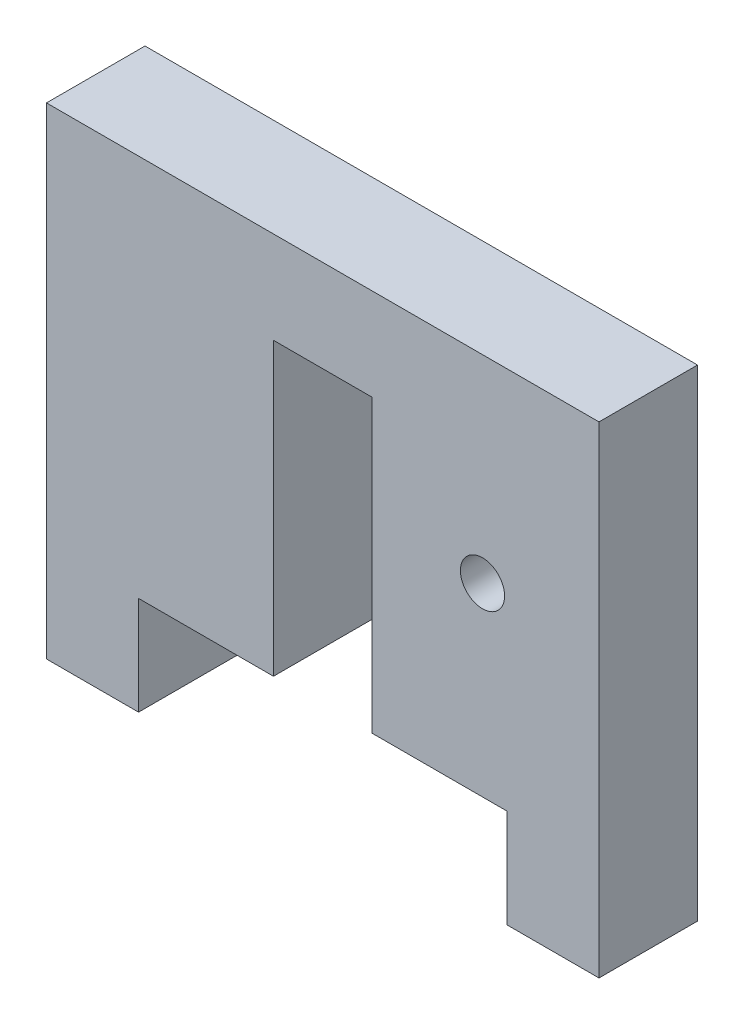
ISO-10303-21;
HEADER;
FILE_DESCRIPTION(('STEP AP214'),'2;1');
FILE_NAME('part.step','',(''),(''),'','','');
FILE_SCHEMA(('AUTOMOTIVE_DESIGN { 1 0 10303 214 1 1 1 1 }'));
ENDSEC;
DATA;
#1=APPLICATION_CONTEXT('core data for automotive mechanical design processes');
#2=APPLICATION_PROTOCOL_DEFINITION('international standard','automotive_design',2000,#1);
#3=PRODUCT_CONTEXT('',#1,'mechanical');
#4=PRODUCT('Part','Part','',(#3));
#5=PRODUCT_RELATED_PRODUCT_CATEGORY('part','',(#4));
#6=PRODUCT_DEFINITION_FORMATION('','',#4);
#7=PRODUCT_DEFINITION_CONTEXT('part definition',#1,'design');
#8=PRODUCT_DEFINITION('design','',#6,#7);
#9=PRODUCT_DEFINITION_SHAPE('','',#8);
#10=(LENGTH_UNIT() NAMED_UNIT(*) SI_UNIT(.MILLI.,.METRE.));
#11=(NAMED_UNIT(*) PLANE_ANGLE_UNIT() SI_UNIT($,.RADIAN.));
#12=(NAMED_UNIT(*) SI_UNIT($,.STERADIAN.) SOLID_ANGLE_UNIT());
#13=UNCERTAINTY_MEASURE_WITH_UNIT(LENGTH_MEASURE(1.E-05),#10,'distance_accuracy_value','');
#14=(GEOMETRIC_REPRESENTATION_CONTEXT(3) GLOBAL_UNCERTAINTY_ASSIGNED_CONTEXT((#13)) GLOBAL_UNIT_ASSIGNED_CONTEXT((#10,
#11,#12)) REPRESENTATION_CONTEXT('',''));
#15=CARTESIAN_POINT('',(0.,0.,0.));
#16=DIRECTION('',(0.,0.,1.));
#17=DIRECTION('',(1.,0.,0.));
#18=AXIS2_PLACEMENT_3D('',#15,#16,#17);
#19=CARTESIAN_POINT('',(0.,0.,5.35));
#20=DIRECTION('',(0.,0.,-1.));
#21=DIRECTION('',(-1.,0.,0.));
#22=AXIS2_PLACEMENT_3D('',#19,#20,#21);
#23=PLANE('',#22);
#24=DIRECTION('',(-1.,0.,0.));
#25=VECTOR('',#24,1.);
#26=CARTESIAN_POINT('',(0.,26.1499993503,5.35));
#27=LINE('',#26,#25);
#28=CARTESIAN_POINT('',(29.9999993294,26.1499993503,5.35));
#29=VERTEX_POINT('',#28);
#30=CARTESIAN_POINT('',(0.,26.1499993503,5.35));
#31=VERTEX_POINT('',#30);
#32=EDGE_CURVE('E177',#29,#31,#27,.T.);
#33=ORIENTED_EDGE('',*,*,#32,.T.);
#34=DIRECTION('',(0.,-1.,0.));
#35=VECTOR('',#34,1.);
#36=CARTESIAN_POINT('',(0.,0.,5.35));
#37=LINE('',#36,#35);
#38=CARTESIAN_POINT('',(0.,0.,5.35));
#39=VERTEX_POINT('',#38);
#40=EDGE_CURVE('E105',#31,#39,#37,.T.);
#41=ORIENTED_EDGE('',*,*,#40,.T.);
#42=DIRECTION('',(1.,0.,0.));
#43=VECTOR('',#42,1.);
#44=CARTESIAN_POINT('',(4.9999989569,0.,5.35));
#45=LINE('',#44,#43);
#46=CARTESIAN_POINT('',(4.9999989569,0.,5.35));
#47=VERTEX_POINT('',#46);
#48=EDGE_CURVE('E204',#39,#47,#45,.T.);
#49=ORIENTED_EDGE('',*,*,#48,.T.);
#50=DIRECTION('',(0.,1.,0.));
#51=VECTOR('',#50,1.);
#52=CARTESIAN_POINT('',(4.9999989569,5.350000225,5.35));
#53=LINE('',#52,#51);
#54=CARTESIAN_POINT('',(4.9999989569,5.350000225,5.35));
#55=VERTEX_POINT('',#54);
#56=EDGE_CURVE('E223',#47,#55,#53,.T.);
#57=ORIENTED_EDGE('',*,*,#56,.T.);
#58=DIRECTION('',(1.,0.,0.));
#59=VECTOR('',#58,1.);
#60=CARTESIAN_POINT('',(12.3250000179,5.350000225,5.35));
#61=LINE('',#60,#59);
#62=CARTESIAN_POINT('',(12.3250000179,5.350000225,5.35));
#63=VERTEX_POINT('',#62);
#64=EDGE_CURVE('E220',#55,#63,#61,.T.);
#65=ORIENTED_EDGE('',*,*,#64,.T.);
#66=DIRECTION('',(0.,1.,0.));
#67=VECTOR('',#66,1.);
#68=CARTESIAN_POINT('',(12.3250000179,21.1500003934,5.35));
#69=LINE('',#68,#67);
#70=CARTESIAN_POINT('',(12.3250000179,21.1500003934,5.35));
#71=VERTEX_POINT('',#70);
#72=EDGE_CURVE('E222',#63,#71,#69,.T.);
#73=ORIENTED_EDGE('',*,*,#72,.T.);
#74=DIRECTION('',(1.,0.,0.));
#75=VECTOR('',#74,1.);
#76=CARTESIAN_POINT('',(17.6749993116,21.1500003934,5.35));
#77=LINE('',#76,#75);
#78=CARTESIAN_POINT('',(17.6749993116,21.1500003934,5.35));
#79=VERTEX_POINT('',#78);
#80=EDGE_CURVE('E225',#71,#79,#77,.T.);
#81=ORIENTED_EDGE('',*,*,#80,.T.);
#82=DIRECTION('',(0.,-1.,0.));
#83=VECTOR('',#82,1.);
#84=CARTESIAN_POINT('',(17.6749993116,5.350000225,5.35));
#85=LINE('',#84,#83);
#86=CARTESIAN_POINT('',(17.6749993116,5.350000225,5.35));
#87=VERTEX_POINT('',#86);
#88=EDGE_CURVE('E231',#79,#87,#85,.T.);
#89=ORIENTED_EDGE('',*,*,#88,.T.);
#90=DIRECTION('',(1.,0.,0.));
#91=VECTOR('',#90,1.);
#92=CARTESIAN_POINT('',(24.9999994412,5.350000225,5.35));
#93=LINE('',#92,#91);
#94=CARTESIAN_POINT('',(24.9999994412,5.350000225,5.35));
#95=VERTEX_POINT('',#94);
#96=EDGE_CURVE('E136',#87,#95,#93,.T.);
#97=ORIENTED_EDGE('',*,*,#96,.T.);
#98=DIRECTION('',(0.,-1.,0.));
#99=VECTOR('',#98,1.);
#100=CARTESIAN_POINT('',(24.9999994412,0.,5.35));
#101=LINE('',#100,#99);
#102=CARTESIAN_POINT('',(24.9999994412,0.,5.35));
#103=VERTEX_POINT('',#102);
#104=EDGE_CURVE('E130',#95,#103,#101,.T.);
#105=ORIENTED_EDGE('',*,*,#104,.T.);
#106=DIRECTION('',(1.,0.,0.));
#107=VECTOR('',#106,1.);
#108=CARTESIAN_POINT('',(29.9999993294,0.,5.35));
#109=LINE('',#108,#107);
#110=CARTESIAN_POINT('',(29.9999993294,0.,5.35));
#111=VERTEX_POINT('',#110);
#112=EDGE_CURVE('E134',#103,#111,#109,.T.);
#113=ORIENTED_EDGE('',*,*,#112,.T.);
#114=DIRECTION('',(0.,1.,0.));
#115=VECTOR('',#114,1.);
#116=CARTESIAN_POINT('',(29.9999993294,26.1499993503,5.35));
#117=LINE('',#116,#115);
#118=EDGE_CURVE('E50',#111,#29,#117,.T.);
#119=ORIENTED_EDGE('',*,*,#118,.T.);
#120=EDGE_LOOP('',(#33,#41,#49,#57,#65,#73,#81,#89,#97,#105,#113,#119));
#121=FACE_BOUND('',#120,.T.);
#122=CARTESIAN_POINT('',(23.6749993294,15.4,5.35));
#123=DIRECTION('',(0.,0.,1.));
#124=DIRECTION('',(1.,0.,0.));
#125=AXIS2_PLACEMENT_3D('',#122,#123,#124);
#126=CIRCLE('',#125,1.19999999999999);
#127=CARTESIAN_POINT('',(24.8749993294,15.4,5.35));
#128=VERTEX_POINT('',#127);
#129=EDGE_CURVE('E158',#128,#128,#126,.T.);
#130=ORIENTED_EDGE('',*,*,#129,.F.);
#131=EDGE_LOOP('',(#130));
#132=FACE_BOUND('',#131,.T.);
#133=ADVANCED_FACE('F33',(#121,#132),#23,.F.);
#134=CARTESIAN_POINT('',(0.,0.,0.));
#135=DIRECTION('',(0.,0.,-1.));
#136=DIRECTION('',(-1.,0.,0.));
#137=AXIS2_PLACEMENT_3D('',#134,#135,#136);
#138=PLANE('',#137);
#139=DIRECTION('',(-1.,0.,0.));
#140=VECTOR('',#139,1.);
#141=CARTESIAN_POINT('',(0.,26.1499993503,0.));
#142=LINE('',#141,#140);
#143=CARTESIAN_POINT('',(29.9999993294,26.1499993503,0.));
#144=VERTEX_POINT('',#143);
#145=CARTESIAN_POINT('',(0.,26.1499993503,0.));
#146=VERTEX_POINT('',#145);
#147=EDGE_CURVE('E154',#144,#146,#142,.T.);
#148=ORIENTED_EDGE('',*,*,#147,.F.);
#149=DIRECTION('',(0.,1.,0.));
#150=VECTOR('',#149,1.);
#151=CARTESIAN_POINT('',(29.9999993294,26.1499993503,0.));
#152=LINE('',#151,#150);
#153=CARTESIAN_POINT('',(29.9999993294,0.,0.));
#154=VERTEX_POINT('',#153);
#155=EDGE_CURVE('E97',#154,#144,#152,.T.);
#156=ORIENTED_EDGE('',*,*,#155,.F.);
#157=DIRECTION('',(1.,0.,0.));
#158=VECTOR('',#157,1.);
#159=CARTESIAN_POINT('',(29.9999993294,0.,0.));
#160=LINE('',#159,#158);
#161=CARTESIAN_POINT('',(24.9999994412,0.,0.));
#162=VERTEX_POINT('',#161);
#163=EDGE_CURVE('E91',#162,#154,#160,.T.);
#164=ORIENTED_EDGE('',*,*,#163,.F.);
#165=DIRECTION('',(0.,-1.,0.));
#166=VECTOR('',#165,1.);
#167=CARTESIAN_POINT('',(24.9999994412,0.,0.));
#168=LINE('',#167,#166);
#169=CARTESIAN_POINT('',(24.9999994412,5.350000225,0.));
#170=VERTEX_POINT('',#169);
#171=EDGE_CURVE('E144',#170,#162,#168,.T.);
#172=ORIENTED_EDGE('',*,*,#171,.F.);
#173=DIRECTION('',(1.,0.,0.));
#174=VECTOR('',#173,1.);
#175=CARTESIAN_POINT('',(24.9999994412,5.350000225,0.));
#176=LINE('',#175,#174);
#177=CARTESIAN_POINT('',(17.6749993116,5.350000225,0.));
#178=VERTEX_POINT('',#177);
#179=EDGE_CURVE('E172',#178,#170,#176,.T.);
#180=ORIENTED_EDGE('',*,*,#179,.F.);
#181=DIRECTION('',(0.,-1.,0.));
#182=VECTOR('',#181,1.);
#183=CARTESIAN_POINT('',(17.6749993116,5.350000225,0.));
#184=LINE('',#183,#182);
#185=CARTESIAN_POINT('',(17.6749993116,21.1500003934,0.));
#186=VERTEX_POINT('',#185);
#187=EDGE_CURVE('E170',#186,#178,#184,.T.);
#188=ORIENTED_EDGE('',*,*,#187,.F.);
#189=DIRECTION('',(1.,0.,0.));
#190=VECTOR('',#189,1.);
#191=CARTESIAN_POINT('',(17.6749993116,21.1500003934,0.));
#192=LINE('',#191,#190);
#193=CARTESIAN_POINT('',(12.3250000179,21.1500003934,0.));
#194=VERTEX_POINT('',#193);
#195=EDGE_CURVE('E168',#194,#186,#192,.T.);
#196=ORIENTED_EDGE('',*,*,#195,.F.);
#197=DIRECTION('',(0.,1.,0.));
#198=VECTOR('',#197,1.);
#199=CARTESIAN_POINT('',(12.3250000179,21.1500003934,0.));
#200=LINE('',#199,#198);
#201=CARTESIAN_POINT('',(12.3250000179,5.350000225,0.));
#202=VERTEX_POINT('',#201);
#203=EDGE_CURVE('E166',#202,#194,#200,.T.);
#204=ORIENTED_EDGE('',*,*,#203,.F.);
#205=DIRECTION('',(1.,0.,0.));
#206=VECTOR('',#205,1.);
#207=CARTESIAN_POINT('',(12.3250000179,5.350000225,0.));
#208=LINE('',#207,#206);
#209=CARTESIAN_POINT('',(4.9999989569,5.350000225,0.));
#210=VERTEX_POINT('',#209);
#211=EDGE_CURVE('E164',#210,#202,#208,.T.);
#212=ORIENTED_EDGE('',*,*,#211,.F.);
#213=DIRECTION('',(0.,1.,0.));
#214=VECTOR('',#213,1.);
#215=CARTESIAN_POINT('',(4.9999989569,5.350000225,0.));
#216=LINE('',#215,#214);
#217=CARTESIAN_POINT('',(4.9999989569,0.,0.));
#218=VERTEX_POINT('',#217);
#219=EDGE_CURVE('E162',#218,#210,#216,.T.);
#220=ORIENTED_EDGE('',*,*,#219,.F.);
#221=DIRECTION('',(1.,0.,0.));
#222=VECTOR('',#221,1.);
#223=CARTESIAN_POINT('',(4.9999989569,0.,0.));
#224=LINE('',#223,#222);
#225=CARTESIAN_POINT('',(0.,0.,0.));
#226=VERTEX_POINT('',#225);
#227=EDGE_CURVE('E160',#226,#218,#224,.T.);
#228=ORIENTED_EDGE('',*,*,#227,.F.);
#229=DIRECTION('',(0.,-1.,0.));
#230=VECTOR('',#229,1.);
#231=CARTESIAN_POINT('',(0.,0.,0.));
#232=LINE('',#231,#230);
#233=EDGE_CURVE('E157',#146,#226,#232,.T.);
#234=ORIENTED_EDGE('',*,*,#233,.F.);
#235=EDGE_LOOP('',(#148,#156,#164,#172,#180,#188,#196,#204,#212,#220,#228,#234));
#236=FACE_BOUND('',#235,.T.);
#237=CARTESIAN_POINT('',(23.6749993294,15.4,0.));
#238=DIRECTION('',(0.,0.,1.));
#239=DIRECTION('',(1.,0.,0.));
#240=AXIS2_PLACEMENT_3D('',#237,#238,#239);
#241=CIRCLE('',#240,1.19999999999999);
#242=CARTESIAN_POINT('',(24.8749993294,15.4,0.));
#243=VERTEX_POINT('',#242);
#244=EDGE_CURVE('E378',#243,#243,#241,.T.);
#245=ORIENTED_EDGE('',*,*,#244,.T.);
#246=EDGE_LOOP('',(#245));
#247=FACE_BOUND('',#246,.T.);
#248=ADVANCED_FACE('F208',(#236,#247),#138,.T.);
#249=CARTESIAN_POINT('',(0.,26.1499993503,5.35));
#250=DIRECTION('',(0.,-1.,0.));
#251=DIRECTION('',(0.,0.,-1.));
#252=AXIS2_PLACEMENT_3D('',#249,#250,#251);
#253=PLANE('',#252);
#254=ORIENTED_EDGE('',*,*,#147,.T.);
#255=DIRECTION('',(0.,0.,-1.));
#256=VECTOR('',#255,1.);
#257=CARTESIAN_POINT('',(0.,26.1499993503,5.35));
#258=LINE('',#257,#256);
#259=EDGE_CURVE('E11',#31,#146,#258,.T.);
#260=ORIENTED_EDGE('',*,*,#259,.F.);
#261=ORIENTED_EDGE('',*,*,#32,.F.);
#262=DIRECTION('',(0.,0.,-1.));
#263=VECTOR('',#262,1.);
#264=CARTESIAN_POINT('',(29.9999993294,26.1499993503,5.35));
#265=LINE('',#264,#263);
#266=EDGE_CURVE('E150',#29,#144,#265,.T.);
#267=ORIENTED_EDGE('',*,*,#266,.T.);
#268=EDGE_LOOP('',(#254,#260,#261,#267));
#269=FACE_BOUND('',#268,.T.);
#270=ADVANCED_FACE('F35',(#269),#253,.F.);
#271=CARTESIAN_POINT('',(0.,0.,5.35));
#272=DIRECTION('',(1.,0.,0.));
#273=DIRECTION('',(0.,0.,-1.));
#274=AXIS2_PLACEMENT_3D('',#271,#272,#273);
#275=PLANE('',#274);
#276=ORIENTED_EDGE('',*,*,#233,.T.);
#277=DIRECTION('',(0.,0.,-1.));
#278=VECTOR('',#277,1.);
#279=CARTESIAN_POINT('',(0.,0.,5.35));
#280=LINE('',#279,#278);
#281=EDGE_CURVE('E42',#39,#226,#280,.T.);
#282=ORIENTED_EDGE('',*,*,#281,.F.);
#283=ORIENTED_EDGE('',*,*,#40,.F.);
#284=ORIENTED_EDGE('',*,*,#259,.T.);
#285=EDGE_LOOP('',(#276,#282,#283,#284));
#286=FACE_BOUND('',#285,.T.);
#287=ADVANCED_FACE('F265',(#286),#275,.F.);
#288=CARTESIAN_POINT('',(4.9999989569,0.,5.35));
#289=DIRECTION('',(0.,1.,0.));
#290=DIRECTION('',(0.,0.,1.));
#291=AXIS2_PLACEMENT_3D('',#288,#289,#290);
#292=PLANE('',#291);
#293=ORIENTED_EDGE('',*,*,#227,.T.);
#294=DIRECTION('',(0.,0.,-1.));
#295=VECTOR('',#294,1.);
#296=CARTESIAN_POINT('',(4.9999989569,0.,5.35));
#297=LINE('',#296,#295);
#298=EDGE_CURVE('E196',#47,#218,#297,.T.);
#299=ORIENTED_EDGE('',*,*,#298,.F.);
#300=ORIENTED_EDGE('',*,*,#48,.F.);
#301=ORIENTED_EDGE('',*,*,#281,.T.);
#302=EDGE_LOOP('',(#293,#299,#300,#301));
#303=FACE_BOUND('',#302,.T.);
#304=ADVANCED_FACE('F202',(#303),#292,.F.);
#305=CARTESIAN_POINT('',(4.9999989569,5.350000225,5.35));
#306=DIRECTION('',(-1.,0.,0.));
#307=DIRECTION('',(0.,0.,1.));
#308=AXIS2_PLACEMENT_3D('',#305,#306,#307);
#309=PLANE('',#308);
#310=ORIENTED_EDGE('',*,*,#219,.T.);
#311=DIRECTION('',(0.,0.,-1.));
#312=VECTOR('',#311,1.);
#313=CARTESIAN_POINT('',(4.9999989569,5.350000225,5.35));
#314=LINE('',#313,#312);
#315=EDGE_CURVE('E193',#55,#210,#314,.T.);
#316=ORIENTED_EDGE('',*,*,#315,.F.);
#317=ORIENTED_EDGE('',*,*,#56,.F.);
#318=ORIENTED_EDGE('',*,*,#298,.T.);
#319=EDGE_LOOP('',(#310,#316,#317,#318));
#320=FACE_BOUND('',#319,.T.);
#321=ADVANCED_FACE('F214',(#320),#309,.F.);
#322=CARTESIAN_POINT('',(12.3250000179,5.350000225,5.35));
#323=DIRECTION('',(0.,1.,0.));
#324=DIRECTION('',(0.,0.,1.));
#325=AXIS2_PLACEMENT_3D('',#322,#323,#324);
#326=PLANE('',#325);
#327=ORIENTED_EDGE('',*,*,#211,.T.);
#328=DIRECTION('',(0.,0.,-1.));
#329=VECTOR('',#328,1.);
#330=CARTESIAN_POINT('',(12.3250000179,5.350000225,5.35));
#331=LINE('',#330,#329);
#332=EDGE_CURVE('E190',#63,#202,#331,.T.);
#333=ORIENTED_EDGE('',*,*,#332,.F.);
#334=ORIENTED_EDGE('',*,*,#64,.F.);
#335=ORIENTED_EDGE('',*,*,#315,.T.);
#336=EDGE_LOOP('',(#327,#333,#334,#335));
#337=FACE_BOUND('',#336,.T.);
#338=ADVANCED_FACE('F218',(#337),#326,.F.);
#339=CARTESIAN_POINT('',(12.3250000179,21.1500003934,5.35));
#340=DIRECTION('',(-1.,0.,0.));
#341=DIRECTION('',(0.,0.,1.));
#342=AXIS2_PLACEMENT_3D('',#339,#340,#341);
#343=PLANE('',#342);
#344=ORIENTED_EDGE('',*,*,#203,.T.);
#345=DIRECTION('',(0.,0.,-1.));
#346=VECTOR('',#345,1.);
#347=CARTESIAN_POINT('',(12.3250000179,21.1500003934,5.35));
#348=LINE('',#347,#346);
#349=EDGE_CURVE('E187',#71,#194,#348,.T.);
#350=ORIENTED_EDGE('',*,*,#349,.F.);
#351=ORIENTED_EDGE('',*,*,#72,.F.);
#352=ORIENTED_EDGE('',*,*,#332,.T.);
#353=EDGE_LOOP('',(#344,#350,#351,#352));
#354=FACE_BOUND('',#353,.T.);
#355=ADVANCED_FACE('F278',(#354),#343,.F.);
#356=CARTESIAN_POINT('',(17.6749993116,21.1500003934,5.35));
#357=DIRECTION('',(0.,1.,0.));
#358=DIRECTION('',(0.,0.,1.));
#359=AXIS2_PLACEMENT_3D('',#356,#357,#358);
#360=PLANE('',#359);
#361=ORIENTED_EDGE('',*,*,#195,.T.);
#362=DIRECTION('',(0.,0.,-1.));
#363=VECTOR('',#362,1.);
#364=CARTESIAN_POINT('',(17.6749993116,21.1500003934,5.35));
#365=LINE('',#364,#363);
#366=EDGE_CURVE('E184',#79,#186,#365,.T.);
#367=ORIENTED_EDGE('',*,*,#366,.F.);
#368=ORIENTED_EDGE('',*,*,#80,.F.);
#369=ORIENTED_EDGE('',*,*,#349,.T.);
#370=EDGE_LOOP('',(#361,#367,#368,#369));
#371=FACE_BOUND('',#370,.T.);
#372=ADVANCED_FACE('F281',(#371),#360,.F.);
#373=CARTESIAN_POINT('',(17.6749993116,5.350000225,5.35));
#374=DIRECTION('',(1.,0.,0.));
#375=DIRECTION('',(0.,0.,-1.));
#376=AXIS2_PLACEMENT_3D('',#373,#374,#375);
#377=PLANE('',#376);
#378=ORIENTED_EDGE('',*,*,#187,.T.);
#379=DIRECTION('',(0.,0.,-1.));
#380=VECTOR('',#379,1.);
#381=CARTESIAN_POINT('',(17.6749993116,5.350000225,5.35));
#382=LINE('',#381,#380);
#383=EDGE_CURVE('E181',#87,#178,#382,.T.);
#384=ORIENTED_EDGE('',*,*,#383,.F.);
#385=ORIENTED_EDGE('',*,*,#88,.F.);
#386=ORIENTED_EDGE('',*,*,#366,.T.);
#387=EDGE_LOOP('',(#378,#384,#385,#386));
#388=FACE_BOUND('',#387,.T.);
#389=ADVANCED_FACE('F237',(#388),#377,.F.);
#390=CARTESIAN_POINT('',(24.9999994412,5.350000225,5.35));
#391=DIRECTION('',(0.,1.,0.));
#392=DIRECTION('',(0.,0.,1.));
#393=AXIS2_PLACEMENT_3D('',#390,#391,#392);
#394=PLANE('',#393);
#395=ORIENTED_EDGE('',*,*,#179,.T.);
#396=DIRECTION('',(0.,0.,-1.));
#397=VECTOR('',#396,1.);
#398=CARTESIAN_POINT('',(24.9999994412,5.350000225,5.35));
#399=LINE('',#398,#397);
#400=EDGE_CURVE('E145',#95,#170,#399,.T.);
#401=ORIENTED_EDGE('',*,*,#400,.F.);
#402=ORIENTED_EDGE('',*,*,#96,.F.);
#403=ORIENTED_EDGE('',*,*,#383,.T.);
#404=EDGE_LOOP('',(#395,#401,#402,#403));
#405=FACE_BOUND('',#404,.T.);
#406=ADVANCED_FACE('F241',(#405),#394,.F.);
#407=CARTESIAN_POINT('',(24.9999994412,0.,5.35));
#408=DIRECTION('',(1.,0.,0.));
#409=DIRECTION('',(0.,0.,-1.));
#410=AXIS2_PLACEMENT_3D('',#407,#408,#409);
#411=PLANE('',#410);
#412=ORIENTED_EDGE('',*,*,#171,.T.);
#413=DIRECTION('',(0.,0.,-1.));
#414=VECTOR('',#413,1.);
#415=CARTESIAN_POINT('',(24.9999994412,0.,5.35));
#416=LINE('',#415,#414);
#417=EDGE_CURVE('E141',#103,#162,#416,.T.);
#418=ORIENTED_EDGE('',*,*,#417,.F.);
#419=ORIENTED_EDGE('',*,*,#104,.F.);
#420=ORIENTED_EDGE('',*,*,#400,.T.);
#421=EDGE_LOOP('',(#412,#418,#419,#420));
#422=FACE_BOUND('',#421,.T.);
#423=ADVANCED_FACE('F142',(#422),#411,.F.);
#424=CARTESIAN_POINT('',(29.9999993294,0.,5.35));
#425=DIRECTION('',(0.,1.,0.));
#426=DIRECTION('',(0.,0.,1.));
#427=AXIS2_PLACEMENT_3D('',#424,#425,#426);
#428=PLANE('',#427);
#429=ORIENTED_EDGE('',*,*,#163,.T.);
#430=DIRECTION('',(0.,0.,-1.));
#431=VECTOR('',#430,1.);
#432=CARTESIAN_POINT('',(29.9999993294,0.,5.35));
#433=LINE('',#432,#431);
#434=EDGE_CURVE('E146',#111,#154,#433,.T.);
#435=ORIENTED_EDGE('',*,*,#434,.F.);
#436=ORIENTED_EDGE('',*,*,#112,.F.);
#437=ORIENTED_EDGE('',*,*,#417,.T.);
#438=EDGE_LOOP('',(#429,#435,#436,#437));
#439=FACE_BOUND('',#438,.T.);
#440=ADVANCED_FACE('F148',(#439),#428,.F.);
#441=CARTESIAN_POINT('',(29.9999993294,26.1499993503,5.35));
#442=DIRECTION('',(-1.,0.,0.));
#443=DIRECTION('',(0.,0.,1.));
#444=AXIS2_PLACEMENT_3D('',#441,#442,#443);
#445=PLANE('',#444);
#446=ORIENTED_EDGE('',*,*,#155,.T.);
#447=ORIENTED_EDGE('',*,*,#266,.F.);
#448=ORIENTED_EDGE('',*,*,#118,.F.);
#449=ORIENTED_EDGE('',*,*,#434,.T.);
#450=EDGE_LOOP('',(#446,#447,#448,#449));
#451=FACE_BOUND('',#450,.T.);
#452=ADVANCED_FACE('F245',(#451),#445,.F.);
#453=CARTESIAN_POINT('',(23.6749993294,15.4,5.35));
#454=DIRECTION('',(0.,0.,-1.));
#455=DIRECTION('',(-1.,0.,0.));
#456=AXIS2_PLACEMENT_3D('',#453,#454,#455);
#457=CYLINDRICAL_SURFACE('',#456,1.19999999999999);
#458=ORIENTED_EDGE('',*,*,#129,.T.);
#459=EDGE_LOOP('',(#458));
#460=FACE_BOUND('',#459,.T.);
#461=ORIENTED_EDGE('',*,*,#244,.F.);
#462=EDGE_LOOP('',(#461));
#463=FACE_BOUND('',#462,.T.);
#464=ADVANCED_FACE('F247',(#460,#463),#457,.F.);
#465=CLOSED_SHELL('',(#133,#248,#270,#287,#304,#321,#338,#355,#372,#389,#406,#423,#440,#452,#464));
#466=MANIFOLD_SOLID_BREP('B2',#465);
#467=ADVANCED_BREP_SHAPE_REPRESENTATION('',(#18,#466),#14);
#468=SHAPE_DEFINITION_REPRESENTATION(#9,#467);
ENDSEC;
END-ISO-10303-21;
